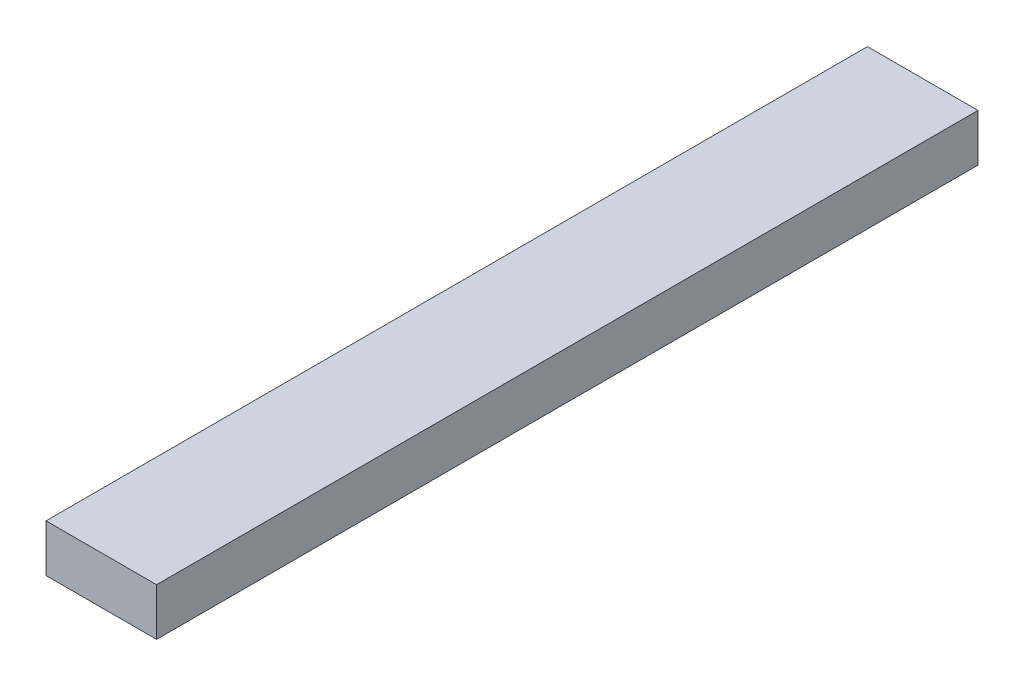
ISO-10303-21;
HEADER;
FILE_DESCRIPTION(('STEP AP214'),'2;1');
FILE_NAME('part.step','',(''),(''),'','','');
FILE_SCHEMA(('AUTOMOTIVE_DESIGN { 1 0 10303 214 1 1 1 1 }'));
ENDSEC;
DATA;
#1=APPLICATION_CONTEXT('core data for automotive mechanical design processes');
#2=APPLICATION_PROTOCOL_DEFINITION('international standard','automotive_design',2000,#1);
#3=PRODUCT_CONTEXT('',#1,'mechanical');
#4=PRODUCT('Part','Part','',(#3));
#5=PRODUCT_RELATED_PRODUCT_CATEGORY('part','',(#4));
#6=PRODUCT_DEFINITION_FORMATION('','',#4);
#7=PRODUCT_DEFINITION_CONTEXT('part definition',#1,'design');
#8=PRODUCT_DEFINITION('design','',#6,#7);
#9=PRODUCT_DEFINITION_SHAPE('','',#8);
#10=(LENGTH_UNIT() NAMED_UNIT(*) SI_UNIT(.MILLI.,.METRE.));
#11=(NAMED_UNIT(*) PLANE_ANGLE_UNIT() SI_UNIT($,.RADIAN.));
#12=(NAMED_UNIT(*) SI_UNIT($,.STERADIAN.) SOLID_ANGLE_UNIT());
#13=UNCERTAINTY_MEASURE_WITH_UNIT(LENGTH_MEASURE(1.E-05),#10,'distance_accuracy_value','');
#14=(GEOMETRIC_REPRESENTATION_CONTEXT(3) GLOBAL_UNCERTAINTY_ASSIGNED_CONTEXT((#13)) GLOBAL_UNIT_ASSIGNED_CONTEXT((#10,
#11,#12)) REPRESENTATION_CONTEXT('',''));
#15=CARTESIAN_POINT('',(0.,0.,0.));
#16=DIRECTION('',(0.,0.,1.));
#17=DIRECTION('',(1.,0.,0.));
#18=AXIS2_PLACEMENT_3D('',#15,#16,#17);
#19=CARTESIAN_POINT('',(0.,0.,660.4));
#20=DIRECTION('',(1.,0.,0.));
#21=DIRECTION('',(0.,0.,-1.));
#22=AXIS2_PLACEMENT_3D('',#19,#20,#21);
#23=PLANE('',#22);
#24=DIRECTION('',(0.,-1.,0.));
#25=VECTOR('',#24,1.);
#26=CARTESIAN_POINT('',(0.,0.,0.));
#27=LINE('',#26,#25);
#28=CARTESIAN_POINT('',(0.,38.1,0.));
#29=VERTEX_POINT('',#28);
#30=CARTESIAN_POINT('',(0.,0.,0.));
#31=VERTEX_POINT('',#30);
#32=EDGE_CURVE('E95',#29,#31,#27,.T.);
#33=ORIENTED_EDGE('',*,*,#32,.T.);
#34=DIRECTION('',(0.,0.,-1.));
#35=VECTOR('',#34,1.);
#36=CARTESIAN_POINT('',(0.,0.,660.4));
#37=LINE('',#36,#35);
#38=CARTESIAN_POINT('',(0.,0.,660.4));
#39=VERTEX_POINT('',#38);
#40=EDGE_CURVE('E11',#39,#31,#37,.T.);
#41=ORIENTED_EDGE('',*,*,#40,.F.);
#42=DIRECTION('',(0.,-1.,0.));
#43=VECTOR('',#42,1.);
#44=CARTESIAN_POINT('',(0.,0.,660.4));
#45=LINE('',#44,#43);
#46=CARTESIAN_POINT('',(0.,38.1,660.4));
#47=VERTEX_POINT('',#46);
#48=EDGE_CURVE('E83',#47,#39,#45,.T.);
#49=ORIENTED_EDGE('',*,*,#48,.F.);
#50=DIRECTION('',(0.,0.,-1.));
#51=VECTOR('',#50,1.);
#52=CARTESIAN_POINT('',(0.,38.1,660.4));
#53=LINE('',#52,#51);
#54=EDGE_CURVE('E91',#47,#29,#53,.T.);
#55=ORIENTED_EDGE('',*,*,#54,.T.);
#56=EDGE_LOOP('',(#33,#41,#49,#55));
#57=FACE_BOUND('',#56,.T.);
#58=ADVANCED_FACE('F32',(#57),#23,.F.);
#59=CARTESIAN_POINT('',(0.,0.,660.4));
#60=DIRECTION('',(0.,1.,0.));
#61=DIRECTION('',(0.,0.,1.));
#62=AXIS2_PLACEMENT_3D('',#59,#60,#61);
#63=PLANE('',#62);
#64=DIRECTION('',(1.,0.,0.));
#65=VECTOR('',#64,1.);
#66=CARTESIAN_POINT('',(0.,0.,0.));
#67=LINE('',#66,#65);
#68=CARTESIAN_POINT('',(88.9,0.,0.));
#69=VERTEX_POINT('',#68);
#70=EDGE_CURVE('E87',#31,#69,#67,.T.);
#71=ORIENTED_EDGE('',*,*,#70,.T.);
#72=DIRECTION('',(0.,0.,-1.));
#73=VECTOR('',#72,1.);
#74=CARTESIAN_POINT('',(88.9,0.,660.4));
#75=LINE('',#74,#73);
#76=CARTESIAN_POINT('',(88.9,0.,660.4));
#77=VERTEX_POINT('',#76);
#78=EDGE_CURVE('E40',#77,#69,#75,.T.);
#79=ORIENTED_EDGE('',*,*,#78,.F.);
#80=DIRECTION('',(1.,0.,0.));
#81=VECTOR('',#80,1.);
#82=CARTESIAN_POINT('',(0.,0.,660.4));
#83=LINE('',#82,#81);
#84=EDGE_CURVE('E78',#39,#77,#83,.T.);
#85=ORIENTED_EDGE('',*,*,#84,.F.);
#86=ORIENTED_EDGE('',*,*,#40,.T.);
#87=EDGE_LOOP('',(#71,#79,#85,#86));
#88=FACE_BOUND('',#87,.T.);
#89=ADVANCED_FACE('F86',(#88),#63,.F.);
#90=CARTESIAN_POINT('',(88.9,0.,660.4));
#91=DIRECTION('',(-1.,0.,0.));
#92=DIRECTION('',(0.,0.,1.));
#93=AXIS2_PLACEMENT_3D('',#90,#91,#92);
#94=PLANE('',#93);
#95=DIRECTION('',(0.,1.,0.));
#96=VECTOR('',#95,1.);
#97=CARTESIAN_POINT('',(88.9,0.,0.));
#98=LINE('',#97,#96);
#99=CARTESIAN_POINT('',(88.9,38.1,0.));
#100=VERTEX_POINT('',#99);
#101=EDGE_CURVE('E65',#69,#100,#98,.T.);
#102=ORIENTED_EDGE('',*,*,#101,.T.);
#103=DIRECTION('',(0.,0.,-1.));
#104=VECTOR('',#103,1.);
#105=CARTESIAN_POINT('',(88.9,38.1,660.4));
#106=LINE('',#105,#104);
#107=CARTESIAN_POINT('',(88.9,38.1,660.4));
#108=VERTEX_POINT('',#107);
#109=EDGE_CURVE('E88',#108,#100,#106,.T.);
#110=ORIENTED_EDGE('',*,*,#109,.F.);
#111=DIRECTION('',(0.,1.,0.));
#112=VECTOR('',#111,1.);
#113=CARTESIAN_POINT('',(88.9,0.,660.4));
#114=LINE('',#113,#112);
#115=EDGE_CURVE('E81',#77,#108,#114,.T.);
#116=ORIENTED_EDGE('',*,*,#115,.F.);
#117=ORIENTED_EDGE('',*,*,#78,.T.);
#118=EDGE_LOOP('',(#102,#110,#116,#117));
#119=FACE_BOUND('',#118,.T.);
#120=ADVANCED_FACE('F89',(#119),#94,.F.);
#121=CARTESIAN_POINT('',(0.,38.1,660.4));
#122=DIRECTION('',(0.,-1.,0.));
#123=DIRECTION('',(0.,0.,-1.));
#124=AXIS2_PLACEMENT_3D('',#121,#122,#123);
#125=PLANE('',#124);
#126=DIRECTION('',(-1.,0.,0.));
#127=VECTOR('',#126,1.);
#128=CARTESIAN_POINT('',(0.,38.1,0.));
#129=LINE('',#128,#127);
#130=EDGE_CURVE('E71',#100,#29,#129,.T.);
#131=ORIENTED_EDGE('',*,*,#130,.T.);
#132=ORIENTED_EDGE('',*,*,#54,.F.);
#133=DIRECTION('',(-1.,0.,0.));
#134=VECTOR('',#133,1.);
#135=CARTESIAN_POINT('',(0.,38.1,660.4));
#136=LINE('',#135,#134);
#137=EDGE_CURVE('E48',#108,#47,#136,.T.);
#138=ORIENTED_EDGE('',*,*,#137,.F.);
#139=ORIENTED_EDGE('',*,*,#109,.T.);
#140=EDGE_LOOP('',(#131,#132,#138,#139));
#141=FACE_BOUND('',#140,.T.);
#142=ADVANCED_FACE('F102',(#141),#125,.F.);
#143=CARTESIAN_POINT('',(0.,0.,660.4));
#144=DIRECTION('',(0.,0.,-1.));
#145=DIRECTION('',(-1.,0.,0.));
#146=AXIS2_PLACEMENT_3D('',#143,#144,#145);
#147=PLANE('',#146);
#148=ORIENTED_EDGE('',*,*,#48,.T.);
#149=ORIENTED_EDGE('',*,*,#84,.T.);
#150=ORIENTED_EDGE('',*,*,#115,.T.);
#151=ORIENTED_EDGE('',*,*,#137,.T.);
#152=EDGE_LOOP('',(#148,#149,#150,#151));
#153=FACE_BOUND('',#152,.T.);
#154=ADVANCED_FACE('F79',(#153),#147,.F.);
#155=CARTESIAN_POINT('',(0.,0.,0.));
#156=DIRECTION('',(0.,0.,-1.));
#157=DIRECTION('',(-1.,0.,0.));
#158=AXIS2_PLACEMENT_3D('',#155,#156,#157);
#159=PLANE('',#158);
#160=ORIENTED_EDGE('',*,*,#32,.F.);
#161=ORIENTED_EDGE('',*,*,#130,.F.);
#162=ORIENTED_EDGE('',*,*,#101,.F.);
#163=ORIENTED_EDGE('',*,*,#70,.F.);
#164=EDGE_LOOP('',(#160,#161,#162,#163));
#165=FACE_BOUND('',#164,.T.);
#166=ADVANCED_FACE('F105',(#165),#159,.T.);
#167=CLOSED_SHELL('',(#58,#89,#120,#142,#154,#166));
#168=MANIFOLD_SOLID_BREP('B2',#167);
#169=ADVANCED_BREP_SHAPE_REPRESENTATION('',(#18,#168),#14);
#170=SHAPE_DEFINITION_REPRESENTATION(#9,#169);
ENDSEC;
END-ISO-10303-21;
